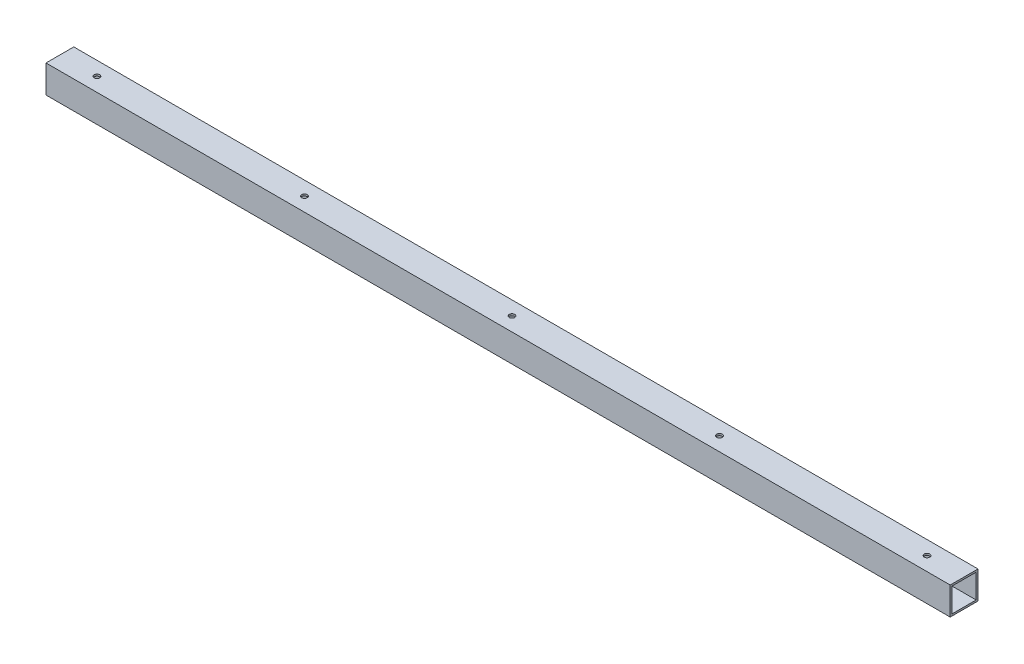
ISO-10303-21;
HEADER;
FILE_DESCRIPTION(('STEP AP214'),'2;1');
FILE_NAME('part.step','',(''),(''),'','','');
FILE_SCHEMA(('AUTOMOTIVE_DESIGN { 1 0 10303 214 1 1 1 1 }'));
ENDSEC;
DATA;
#1=APPLICATION_CONTEXT('core data for automotive mechanical design processes');
#2=APPLICATION_PROTOCOL_DEFINITION('international standard','automotive_design',2000,#1);
#3=PRODUCT_CONTEXT('',#1,'mechanical');
#4=PRODUCT('Part','Part','',(#3));
#5=PRODUCT_RELATED_PRODUCT_CATEGORY('part','',(#4));
#6=PRODUCT_DEFINITION_FORMATION('','',#4);
#7=PRODUCT_DEFINITION_CONTEXT('part definition',#1,'design');
#8=PRODUCT_DEFINITION('design','',#6,#7);
#9=PRODUCT_DEFINITION_SHAPE('','',#8);
#10=(LENGTH_UNIT() NAMED_UNIT(*) SI_UNIT(.MILLI.,.METRE.));
#11=(NAMED_UNIT(*) PLANE_ANGLE_UNIT() SI_UNIT($,.RADIAN.));
#12=(NAMED_UNIT(*) SI_UNIT($,.STERADIAN.) SOLID_ANGLE_UNIT());
#13=UNCERTAINTY_MEASURE_WITH_UNIT(LENGTH_MEASURE(1.E-05),#10,'distance_accuracy_value','');
#14=(GEOMETRIC_REPRESENTATION_CONTEXT(3) GLOBAL_UNCERTAINTY_ASSIGNED_CONTEXT((#13)) GLOBAL_UNIT_ASSIGNED_CONTEXT((#10,
#11,#12)) REPRESENTATION_CONTEXT('',''));
#15=CARTESIAN_POINT('',(0.,0.,0.));
#16=DIRECTION('',(0.,0.,1.));
#17=DIRECTION('',(1.,0.,0.));
#18=AXIS2_PLACEMENT_3D('',#15,#16,#17);
#19=CARTESIAN_POINT('',(244.,7.5,-7.5));
#20=DIRECTION('',(0.,0.,1.));
#21=DIRECTION('',(0.,-1.,0.));
#22=AXIS2_PLACEMENT_3D('',#19,#20,#21);
#23=PLANE('',#22);
#24=DIRECTION('',(0.,1.,0.));
#25=VECTOR('',#24,1.);
#26=CARTESIAN_POINT('',(-244.,7.5,-7.5));
#27=LINE('',#26,#25);
#28=CARTESIAN_POINT('',(-244.,-7.5,-7.5));
#29=VERTEX_POINT('',#28);
#30=CARTESIAN_POINT('',(-244.,7.5,-7.5));
#31=VERTEX_POINT('',#30);
#32=EDGE_CURVE('E160',#29,#31,#27,.T.);
#33=ORIENTED_EDGE('',*,*,#32,.T.);
#34=DIRECTION('',(-1.,0.,0.));
#35=VECTOR('',#34,1.);
#36=CARTESIAN_POINT('',(244.,7.5,-7.5));
#37=LINE('',#36,#35);
#38=CARTESIAN_POINT('',(244.,7.5,-7.5));
#39=VERTEX_POINT('',#38);
#40=EDGE_CURVE('E12',#39,#31,#37,.T.);
#41=ORIENTED_EDGE('',*,*,#40,.F.);
#42=DIRECTION('',(0.,1.,0.));
#43=VECTOR('',#42,1.);
#44=CARTESIAN_POINT('',(244.,7.5,-7.5));
#45=LINE('',#44,#43);
#46=CARTESIAN_POINT('',(244.,-7.5,-7.5));
#47=VERTEX_POINT('',#46);
#48=EDGE_CURVE('E133',#47,#39,#45,.T.);
#49=ORIENTED_EDGE('',*,*,#48,.F.);
#50=DIRECTION('',(-1.,0.,0.));
#51=VECTOR('',#50,1.);
#52=CARTESIAN_POINT('',(244.,-7.5,-7.5));
#53=LINE('',#52,#51);
#54=EDGE_CURVE('E167',#47,#29,#53,.T.);
#55=ORIENTED_EDGE('',*,*,#54,.T.);
#56=EDGE_LOOP('',(#33,#41,#49,#55));
#57=FACE_BOUND('',#56,.T.);
#58=ADVANCED_FACE('F52',(#57),#23,.F.);
#59=CARTESIAN_POINT('',(244.,7.5,7.5));
#60=DIRECTION('',(0.,-1.,0.));
#61=DIRECTION('',(0.,0.,-1.));
#62=AXIS2_PLACEMENT_3D('',#59,#60,#61);
#63=PLANE('',#62);
#64=CARTESIAN_POINT('',(-112.,7.5,0.));
#65=DIRECTION('',(0.,1.,0.));
#66=DIRECTION('',(0.,0.,1.));
#67=AXIS2_PLACEMENT_3D('',#64,#65,#66);
#68=CIRCLE('',#67,1.49999999999997);
#69=CARTESIAN_POINT('',(-112.,7.5,1.49999999999997));
#70=VERTEX_POINT('',#69);
#71=EDGE_CURVE('E235',#70,#70,#68,.T.);
#72=ORIENTED_EDGE('',*,*,#71,.F.);
#73=EDGE_LOOP('',(#72));
#74=FACE_BOUND('',#73,.T.);
#75=CARTESIAN_POINT('',(0.,7.5,0.));
#76=DIRECTION('',(0.,1.,0.));
#77=DIRECTION('',(0.,0.,1.));
#78=AXIS2_PLACEMENT_3D('',#75,#76,#77);
#79=CIRCLE('',#78,1.49999999999997);
#80=CARTESIAN_POINT('',(0.,7.5,1.49999999999997));
#81=VERTEX_POINT('',#80);
#82=EDGE_CURVE('E251',#81,#81,#79,.T.);
#83=ORIENTED_EDGE('',*,*,#82,.F.);
#84=EDGE_LOOP('',(#83));
#85=FACE_BOUND('',#84,.T.);
#86=CARTESIAN_POINT('',(112.,7.5,0.));
#87=DIRECTION('',(0.,1.,0.));
#88=DIRECTION('',(0.,0.,1.));
#89=AXIS2_PLACEMENT_3D('',#86,#87,#88);
#90=CIRCLE('',#89,1.49999999999997);
#91=CARTESIAN_POINT('',(112.,7.5,1.49999999999997));
#92=VERTEX_POINT('',#91);
#93=EDGE_CURVE('E245',#92,#92,#90,.T.);
#94=ORIENTED_EDGE('',*,*,#93,.F.);
#95=EDGE_LOOP('',(#94));
#96=FACE_BOUND('',#95,.T.);
#97=CARTESIAN_POINT('',(224.,7.5,0.));
#98=DIRECTION('',(0.,1.,0.));
#99=DIRECTION('',(0.,0.,1.));
#100=AXIS2_PLACEMENT_3D('',#97,#98,#99);
#101=CIRCLE('',#100,1.50000000000003);
#102=CARTESIAN_POINT('',(224.,7.5,1.50000000000002));
#103=VERTEX_POINT('',#102);
#104=EDGE_CURVE('E239',#103,#103,#101,.T.);
#105=ORIENTED_EDGE('',*,*,#104,.F.);
#106=EDGE_LOOP('',(#105));
#107=FACE_BOUND('',#106,.T.);
#108=CARTESIAN_POINT('',(-224.,7.5,0.));
#109=DIRECTION('',(0.,1.,0.));
#110=DIRECTION('',(0.,0.,1.));
#111=AXIS2_PLACEMENT_3D('',#108,#109,#110);
#112=CIRCLE('',#111,1.5);
#113=CARTESIAN_POINT('',(-224.,7.5,1.5));
#114=VERTEX_POINT('',#113);
#115=EDGE_CURVE('E205',#114,#114,#112,.T.);
#116=ORIENTED_EDGE('',*,*,#115,.F.);
#117=EDGE_LOOP('',(#116));
#118=FACE_BOUND('',#117,.T.);
#119=DIRECTION('',(0.,0.,1.));
#120=VECTOR('',#119,1.);
#121=CARTESIAN_POINT('',(-244.,7.5,7.5));
#122=LINE('',#121,#120);
#123=CARTESIAN_POINT('',(-244.,7.5,7.5));
#124=VERTEX_POINT('',#123);
#125=EDGE_CURVE('E138',#31,#124,#122,.T.);
#126=ORIENTED_EDGE('',*,*,#125,.T.);
#127=DIRECTION('',(-1.,0.,0.));
#128=VECTOR('',#127,1.);
#129=CARTESIAN_POINT('',(244.,7.5,7.5));
#130=LINE('',#129,#128);
#131=CARTESIAN_POINT('',(244.,7.5,7.5));
#132=VERTEX_POINT('',#131);
#133=EDGE_CURVE('E62',#132,#124,#130,.T.);
#134=ORIENTED_EDGE('',*,*,#133,.F.);
#135=DIRECTION('',(0.,0.,1.));
#136=VECTOR('',#135,1.);
#137=CARTESIAN_POINT('',(244.,7.5,7.5));
#138=LINE('',#137,#136);
#139=EDGE_CURVE('E127',#39,#132,#138,.T.);
#140=ORIENTED_EDGE('',*,*,#139,.F.);
#141=ORIENTED_EDGE('',*,*,#40,.T.);
#142=EDGE_LOOP('',(#126,#134,#140,#141));
#143=FACE_BOUND('',#142,.T.);
#144=ADVANCED_FACE('F137',(#74,#85,#96,#107,#118,#143),#63,.F.);
#145=CARTESIAN_POINT('',(244.,7.5,7.5));
#146=DIRECTION('',(0.,0.,-1.));
#147=DIRECTION('',(0.,1.,0.));
#148=AXIS2_PLACEMENT_3D('',#145,#146,#147);
#149=PLANE('',#148);
#150=DIRECTION('',(0.,-1.,0.));
#151=VECTOR('',#150,1.);
#152=CARTESIAN_POINT('',(-244.,7.5,7.5));
#153=LINE('',#152,#151);
#154=CARTESIAN_POINT('',(-244.,-7.5,7.5));
#155=VERTEX_POINT('',#154);
#156=EDGE_CURVE('E100',#124,#155,#153,.T.);
#157=ORIENTED_EDGE('',*,*,#156,.T.);
#158=DIRECTION('',(-1.,0.,0.));
#159=VECTOR('',#158,1.);
#160=CARTESIAN_POINT('',(244.,-7.5,7.5));
#161=LINE('',#160,#159);
#162=CARTESIAN_POINT('',(244.,-7.5,7.5));
#163=VERTEX_POINT('',#162);
#164=EDGE_CURVE('E139',#163,#155,#161,.T.);
#165=ORIENTED_EDGE('',*,*,#164,.F.);
#166=DIRECTION('',(0.,-1.,0.));
#167=VECTOR('',#166,1.);
#168=CARTESIAN_POINT('',(244.,7.5,7.5));
#169=LINE('',#168,#167);
#170=EDGE_CURVE('E131',#132,#163,#169,.T.);
#171=ORIENTED_EDGE('',*,*,#170,.F.);
#172=ORIENTED_EDGE('',*,*,#133,.T.);
#173=EDGE_LOOP('',(#157,#165,#171,#172));
#174=FACE_BOUND('',#173,.T.);
#175=ADVANCED_FACE('F141',(#174),#149,.F.);
#176=CARTESIAN_POINT('',(244.,6.5,6.5));
#177=DIRECTION('',(0.,0.,-1.));
#178=DIRECTION('',(-1.,0.,0.));
#179=AXIS2_PLACEMENT_3D('',#176,#177,#178);
#180=PLANE('',#179);
#181=DIRECTION('',(0.,-1.,0.));
#182=VECTOR('',#181,1.);
#183=CARTESIAN_POINT('',(-244.,6.5,6.5));
#184=LINE('',#183,#182);
#185=CARTESIAN_POINT('',(-244.,6.5,6.5));
#186=VERTEX_POINT('',#185);
#187=CARTESIAN_POINT('',(-244.,-6.5,6.5));
#188=VERTEX_POINT('',#187);
#189=EDGE_CURVE('E147',#186,#188,#184,.T.);
#190=ORIENTED_EDGE('',*,*,#189,.F.);
#191=DIRECTION('',(-1.,0.,0.));
#192=VECTOR('',#191,1.);
#193=CARTESIAN_POINT('',(244.,6.5,6.5));
#194=LINE('',#193,#192);
#195=CARTESIAN_POINT('',(244.,6.5,6.5));
#196=VERTEX_POINT('',#195);
#197=EDGE_CURVE('E56',#196,#186,#194,.T.);
#198=ORIENTED_EDGE('',*,*,#197,.F.);
#199=DIRECTION('',(0.,-1.,0.));
#200=VECTOR('',#199,1.);
#201=CARTESIAN_POINT('',(244.,6.5,6.5));
#202=LINE('',#201,#200);
#203=CARTESIAN_POINT('',(244.,-6.5,6.5));
#204=VERTEX_POINT('',#203);
#205=EDGE_CURVE('E166',#196,#204,#202,.T.);
#206=ORIENTED_EDGE('',*,*,#205,.T.);
#207=DIRECTION('',(-1.,0.,0.));
#208=VECTOR('',#207,1.);
#209=CARTESIAN_POINT('',(244.,-6.5,6.5));
#210=LINE('',#209,#208);
#211=EDGE_CURVE('E143',#204,#188,#210,.T.);
#212=ORIENTED_EDGE('',*,*,#211,.T.);
#213=EDGE_LOOP('',(#190,#198,#206,#212));
#214=FACE_BOUND('',#213,.T.);
#215=ADVANCED_FACE('F54',(#214),#180,.T.);
#216=CARTESIAN_POINT('',(244.,6.5,6.5));
#217=DIRECTION('',(0.,-1.,0.));
#218=DIRECTION('',(0.,0.,-1.));
#219=AXIS2_PLACEMENT_3D('',#216,#217,#218);
#220=PLANE('',#219);
#221=CARTESIAN_POINT('',(-112.,6.5,0.));
#222=DIRECTION('',(0.,-1.,0.));
#223=DIRECTION('',(0.,0.,-1.));
#224=AXIS2_PLACEMENT_3D('',#221,#222,#223);
#225=CIRCLE('',#224,1.49999999999997);
#226=CARTESIAN_POINT('',(-112.,6.5,-1.49999999999997));
#227=VERTEX_POINT('',#226);
#228=EDGE_CURVE('E209',#227,#227,#225,.F.);
#229=ORIENTED_EDGE('',*,*,#228,.T.);
#230=EDGE_LOOP('',(#229));
#231=FACE_BOUND('',#230,.T.);
#232=CARTESIAN_POINT('',(0.,6.5,0.));
#233=DIRECTION('',(0.,-1.,0.));
#234=DIRECTION('',(0.,0.,-1.));
#235=AXIS2_PLACEMENT_3D('',#232,#233,#234);
#236=CIRCLE('',#235,1.49999999999997);
#237=CARTESIAN_POINT('',(0.,6.5,-1.49999999999997));
#238=VERTEX_POINT('',#237);
#239=EDGE_CURVE('E217',#238,#238,#236,.F.);
#240=ORIENTED_EDGE('',*,*,#239,.T.);
#241=EDGE_LOOP('',(#240));
#242=FACE_BOUND('',#241,.T.);
#243=CARTESIAN_POINT('',(112.,6.5,0.));
#244=DIRECTION('',(0.,-1.,0.));
#245=DIRECTION('',(0.,0.,-1.));
#246=AXIS2_PLACEMENT_3D('',#243,#244,#245);
#247=CIRCLE('',#246,1.49999999999997);
#248=CARTESIAN_POINT('',(112.,6.5,-1.49999999999997));
#249=VERTEX_POINT('',#248);
#250=EDGE_CURVE('E223',#249,#249,#247,.F.);
#251=ORIENTED_EDGE('',*,*,#250,.T.);
#252=EDGE_LOOP('',(#251));
#253=FACE_BOUND('',#252,.T.);
#254=CARTESIAN_POINT('',(224.,6.5,0.));
#255=DIRECTION('',(0.,-1.,0.));
#256=DIRECTION('',(0.,0.,-1.));
#257=AXIS2_PLACEMENT_3D('',#254,#255,#256);
#258=CIRCLE('',#257,1.50000000000003);
#259=CARTESIAN_POINT('',(224.,6.5,-1.50000000000003));
#260=VERTEX_POINT('',#259);
#261=EDGE_CURVE('E229',#260,#260,#258,.F.);
#262=ORIENTED_EDGE('',*,*,#261,.T.);
#263=EDGE_LOOP('',(#262));
#264=FACE_BOUND('',#263,.T.);
#265=CARTESIAN_POINT('',(-224.,6.5,0.));
#266=DIRECTION('',(0.,-1.,0.));
#267=DIRECTION('',(0.,0.,-1.));
#268=AXIS2_PLACEMENT_3D('',#265,#266,#267);
#269=CIRCLE('',#268,1.5);
#270=CARTESIAN_POINT('',(-224.,6.5,-1.5));
#271=VERTEX_POINT('',#270);
#272=EDGE_CURVE('E151',#271,#271,#269,.F.);
#273=ORIENTED_EDGE('',*,*,#272,.T.);
#274=EDGE_LOOP('',(#273));
#275=FACE_BOUND('',#274,.T.);
#276=DIRECTION('',(0.,0.,1.));
#277=VECTOR('',#276,1.);
#278=CARTESIAN_POINT('',(-244.,6.5,6.5));
#279=LINE('',#278,#277);
#280=CARTESIAN_POINT('',(-244.,6.5,-6.5));
#281=VERTEX_POINT('',#280);
#282=EDGE_CURVE('E150',#281,#186,#279,.T.);
#283=ORIENTED_EDGE('',*,*,#282,.F.);
#284=DIRECTION('',(-1.,0.,0.));
#285=VECTOR('',#284,1.);
#286=CARTESIAN_POINT('',(244.,6.5,-6.5));
#287=LINE('',#286,#285);
#288=CARTESIAN_POINT('',(244.,6.5,-6.5));
#289=VERTEX_POINT('',#288);
#290=EDGE_CURVE('E172',#289,#281,#287,.T.);
#291=ORIENTED_EDGE('',*,*,#290,.F.);
#292=DIRECTION('',(0.,0.,1.));
#293=VECTOR('',#292,1.);
#294=CARTESIAN_POINT('',(244.,6.5,6.5));
#295=LINE('',#294,#293);
#296=EDGE_CURVE('E181',#289,#196,#295,.T.);
#297=ORIENTED_EDGE('',*,*,#296,.T.);
#298=ORIENTED_EDGE('',*,*,#197,.T.);
#299=EDGE_LOOP('',(#283,#291,#297,#298));
#300=FACE_BOUND('',#299,.T.);
#301=ADVANCED_FACE('F179',(#231,#242,#253,#264,#275,#300),#220,.T.);
#302=CARTESIAN_POINT('',(244.,6.5,-6.5));
#303=DIRECTION('',(0.,0.,1.));
#304=DIRECTION('',(0.,-1.,0.));
#305=AXIS2_PLACEMENT_3D('',#302,#303,#304);
#306=PLANE('',#305);
#307=DIRECTION('',(0.,1.,0.));
#308=VECTOR('',#307,1.);
#309=CARTESIAN_POINT('',(-244.,6.5,-6.5));
#310=LINE('',#309,#308);
#311=CARTESIAN_POINT('',(-244.,-6.5,-6.5));
#312=VERTEX_POINT('',#311);
#313=EDGE_CURVE('E154',#312,#281,#310,.T.);
#314=ORIENTED_EDGE('',*,*,#313,.F.);
#315=DIRECTION('',(-1.,0.,0.));
#316=VECTOR('',#315,1.);
#317=CARTESIAN_POINT('',(244.,-6.5,-6.5));
#318=LINE('',#317,#316);
#319=CARTESIAN_POINT('',(244.,-6.5,-6.5));
#320=VERTEX_POINT('',#319);
#321=EDGE_CURVE('E171',#320,#312,#318,.T.);
#322=ORIENTED_EDGE('',*,*,#321,.F.);
#323=DIRECTION('',(0.,1.,0.));
#324=VECTOR('',#323,1.);
#325=CARTESIAN_POINT('',(244.,6.5,-6.5));
#326=LINE('',#325,#324);
#327=EDGE_CURVE('E188',#320,#289,#326,.T.);
#328=ORIENTED_EDGE('',*,*,#327,.T.);
#329=ORIENTED_EDGE('',*,*,#290,.T.);
#330=EDGE_LOOP('',(#314,#322,#328,#329));
#331=FACE_BOUND('',#330,.T.);
#332=ADVANCED_FACE('F186',(#331),#306,.T.);
#333=CARTESIAN_POINT('',(244.,-6.5,6.5));
#334=DIRECTION('',(0.,1.,0.));
#335=DIRECTION('',(0.,0.,1.));
#336=AXIS2_PLACEMENT_3D('',#333,#334,#335);
#337=PLANE('',#336);
#338=CARTESIAN_POINT('',(-112.,-6.5,0.));
#339=DIRECTION('',(0.,1.,0.));
#340=DIRECTION('',(0.,0.,1.));
#341=AXIS2_PLACEMENT_3D('',#338,#339,#340);
#342=CIRCLE('',#341,1.49999999999997);
#343=CARTESIAN_POINT('',(-112.,-6.5,1.49999999999997));
#344=VERTEX_POINT('',#343);
#345=EDGE_CURVE('E214',#344,#344,#342,.F.);
#346=ORIENTED_EDGE('',*,*,#345,.T.);
#347=EDGE_LOOP('',(#346));
#348=FACE_BOUND('',#347,.T.);
#349=CARTESIAN_POINT('',(0.,-6.5,0.));
#350=DIRECTION('',(0.,1.,0.));
#351=DIRECTION('',(0.,0.,1.));
#352=AXIS2_PLACEMENT_3D('',#349,#350,#351);
#353=CIRCLE('',#352,1.49999999999997);
#354=CARTESIAN_POINT('',(0.,-6.5,1.49999999999997));
#355=VERTEX_POINT('',#354);
#356=EDGE_CURVE('E220',#355,#355,#353,.F.);
#357=ORIENTED_EDGE('',*,*,#356,.T.);
#358=EDGE_LOOP('',(#357));
#359=FACE_BOUND('',#358,.T.);
#360=CARTESIAN_POINT('',(112.,-6.5,0.));
#361=DIRECTION('',(0.,1.,0.));
#362=DIRECTION('',(0.,0.,1.));
#363=AXIS2_PLACEMENT_3D('',#360,#361,#362);
#364=CIRCLE('',#363,1.49999999999997);
#365=CARTESIAN_POINT('',(112.,-6.5,1.49999999999997));
#366=VERTEX_POINT('',#365);
#367=EDGE_CURVE('E226',#366,#366,#364,.F.);
#368=ORIENTED_EDGE('',*,*,#367,.T.);
#369=EDGE_LOOP('',(#368));
#370=FACE_BOUND('',#369,.T.);
#371=CARTESIAN_POINT('',(224.,-6.5,0.));
#372=DIRECTION('',(0.,1.,0.));
#373=DIRECTION('',(0.,0.,1.));
#374=AXIS2_PLACEMENT_3D('',#371,#372,#373);
#375=CIRCLE('',#374,1.50000000000003);
#376=CARTESIAN_POINT('',(224.,-6.5,1.50000000000002));
#377=VERTEX_POINT('',#376);
#378=EDGE_CURVE('E232',#377,#377,#375,.F.);
#379=ORIENTED_EDGE('',*,*,#378,.T.);
#380=EDGE_LOOP('',(#379));
#381=FACE_BOUND('',#380,.T.);
#382=CARTESIAN_POINT('',(-224.,-6.5,0.));
#383=DIRECTION('',(0.,1.,0.));
#384=DIRECTION('',(0.,0.,1.));
#385=AXIS2_PLACEMENT_3D('',#382,#383,#384);
#386=CIRCLE('',#385,1.5);
#387=CARTESIAN_POINT('',(-224.,-6.5,1.5));
#388=VERTEX_POINT('',#387);
#389=EDGE_CURVE('E202',#388,#388,#386,.F.);
#390=ORIENTED_EDGE('',*,*,#389,.T.);
#391=EDGE_LOOP('',(#390));
#392=FACE_BOUND('',#391,.T.);
#393=DIRECTION('',(0.,0.,-1.));
#394=VECTOR('',#393,1.);
#395=CARTESIAN_POINT('',(-244.,-6.5,6.5));
#396=LINE('',#395,#394);
#397=EDGE_CURVE('E157',#188,#312,#396,.T.);
#398=ORIENTED_EDGE('',*,*,#397,.F.);
#399=ORIENTED_EDGE('',*,*,#211,.F.);
#400=DIRECTION('',(0.,0.,-1.));
#401=VECTOR('',#400,1.);
#402=CARTESIAN_POINT('',(244.,-6.5,6.5));
#403=LINE('',#402,#401);
#404=EDGE_CURVE('E193',#204,#320,#403,.T.);
#405=ORIENTED_EDGE('',*,*,#404,.T.);
#406=ORIENTED_EDGE('',*,*,#321,.T.);
#407=EDGE_LOOP('',(#398,#399,#405,#406));
#408=FACE_BOUND('',#407,.T.);
#409=ADVANCED_FACE('F195',(#348,#359,#370,#381,#392,#408),#337,.T.);
#410=CARTESIAN_POINT('',(244.,-7.5,7.5));
#411=DIRECTION('',(0.,1.,0.));
#412=DIRECTION('',(0.,0.,1.));
#413=AXIS2_PLACEMENT_3D('',#410,#411,#412);
#414=PLANE('',#413);
#415=CARTESIAN_POINT('',(-112.,-7.5,0.));
#416=DIRECTION('',(0.,1.,0.));
#417=DIRECTION('',(0.,0.,1.));
#418=AXIS2_PLACEMENT_3D('',#415,#416,#417);
#419=CIRCLE('',#418,1.49999999999997);
#420=CARTESIAN_POINT('',(-112.,-7.5,1.49999999999997));
#421=VERTEX_POINT('',#420);
#422=EDGE_CURVE('E254',#421,#421,#419,.T.);
#423=ORIENTED_EDGE('',*,*,#422,.T.);
#424=EDGE_LOOP('',(#423));
#425=FACE_BOUND('',#424,.T.);
#426=CARTESIAN_POINT('',(0.,-7.5,0.));
#427=DIRECTION('',(0.,1.,0.));
#428=DIRECTION('',(0.,0.,1.));
#429=AXIS2_PLACEMENT_3D('',#426,#427,#428);
#430=CIRCLE('',#429,1.49999999999997);
#431=CARTESIAN_POINT('',(0.,-7.5,1.49999999999997));
#432=VERTEX_POINT('',#431);
#433=EDGE_CURVE('E248',#432,#432,#430,.T.);
#434=ORIENTED_EDGE('',*,*,#433,.T.);
#435=EDGE_LOOP('',(#434));
#436=FACE_BOUND('',#435,.T.);
#437=CARTESIAN_POINT('',(112.,-7.5,0.));
#438=DIRECTION('',(0.,1.,0.));
#439=DIRECTION('',(0.,0.,1.));
#440=AXIS2_PLACEMENT_3D('',#437,#438,#439);
#441=CIRCLE('',#440,1.49999999999997);
#442=CARTESIAN_POINT('',(112.,-7.5,1.49999999999997));
#443=VERTEX_POINT('',#442);
#444=EDGE_CURVE('E242',#443,#443,#441,.T.);
#445=ORIENTED_EDGE('',*,*,#444,.T.);
#446=EDGE_LOOP('',(#445));
#447=FACE_BOUND('',#446,.T.);
#448=CARTESIAN_POINT('',(224.,-7.5,0.));
#449=DIRECTION('',(0.,1.,0.));
#450=DIRECTION('',(0.,0.,1.));
#451=AXIS2_PLACEMENT_3D('',#448,#449,#450);
#452=CIRCLE('',#451,1.50000000000003);
#453=CARTESIAN_POINT('',(224.,-7.5,1.50000000000002));
#454=VERTEX_POINT('',#453);
#455=EDGE_CURVE('E236',#454,#454,#452,.T.);
#456=ORIENTED_EDGE('',*,*,#455,.T.);
#457=EDGE_LOOP('',(#456));
#458=FACE_BOUND('',#457,.T.);
#459=CARTESIAN_POINT('',(-224.,-7.5,0.));
#460=DIRECTION('',(0.,1.,0.));
#461=DIRECTION('',(0.,0.,1.));
#462=AXIS2_PLACEMENT_3D('',#459,#460,#461);
#463=CIRCLE('',#462,1.5);
#464=CARTESIAN_POINT('',(-224.,-7.5,1.5));
#465=VERTEX_POINT('',#464);
#466=EDGE_CURVE('E206',#465,#465,#463,.T.);
#467=ORIENTED_EDGE('',*,*,#466,.T.);
#468=EDGE_LOOP('',(#467));
#469=FACE_BOUND('',#468,.T.);
#470=DIRECTION('',(0.,0.,-1.));
#471=VECTOR('',#470,1.);
#472=CARTESIAN_POINT('',(-244.,-7.5,7.5));
#473=LINE('',#472,#471);
#474=EDGE_CURVE('E106',#155,#29,#473,.T.);
#475=ORIENTED_EDGE('',*,*,#474,.T.);
#476=ORIENTED_EDGE('',*,*,#54,.F.);
#477=DIRECTION('',(0.,0.,-1.));
#478=VECTOR('',#477,1.);
#479=CARTESIAN_POINT('',(244.,-7.5,7.5));
#480=LINE('',#479,#478);
#481=EDGE_CURVE('E71',#163,#47,#480,.T.);
#482=ORIENTED_EDGE('',*,*,#481,.F.);
#483=ORIENTED_EDGE('',*,*,#164,.T.);
#484=EDGE_LOOP('',(#475,#476,#482,#483));
#485=FACE_BOUND('',#484,.T.);
#486=ADVANCED_FACE('F299',(#425,#436,#447,#458,#469,#485),#414,.F.);
#487=CARTESIAN_POINT('',(244.,0.,0.));
#488=DIRECTION('',(1.,0.,0.));
#489=DIRECTION('',(0.,0.,-1.));
#490=AXIS2_PLACEMENT_3D('',#487,#488,#489);
#491=PLANE('',#490);
#492=ORIENTED_EDGE('',*,*,#205,.F.);
#493=ORIENTED_EDGE('',*,*,#296,.F.);
#494=ORIENTED_EDGE('',*,*,#327,.F.);
#495=ORIENTED_EDGE('',*,*,#404,.F.);
#496=EDGE_LOOP('',(#492,#493,#494,#495));
#497=FACE_BOUND('',#496,.T.);
#498=ORIENTED_EDGE('',*,*,#48,.T.);
#499=ORIENTED_EDGE('',*,*,#139,.T.);
#500=ORIENTED_EDGE('',*,*,#170,.T.);
#501=ORIENTED_EDGE('',*,*,#481,.T.);
#502=EDGE_LOOP('',(#498,#499,#500,#501));
#503=FACE_BOUND('',#502,.T.);
#504=ADVANCED_FACE('F129',(#497,#503),#491,.T.);
#505=CARTESIAN_POINT('',(-244.,0.,0.));
#506=DIRECTION('',(1.,0.,0.));
#507=DIRECTION('',(0.,0.,-1.));
#508=AXIS2_PLACEMENT_3D('',#505,#506,#507);
#509=PLANE('',#508);
#510=ORIENTED_EDGE('',*,*,#189,.T.);
#511=ORIENTED_EDGE('',*,*,#397,.T.);
#512=ORIENTED_EDGE('',*,*,#313,.T.);
#513=ORIENTED_EDGE('',*,*,#282,.T.);
#514=EDGE_LOOP('',(#510,#511,#512,#513));
#515=FACE_BOUND('',#514,.T.);
#516=ORIENTED_EDGE('',*,*,#32,.F.);
#517=ORIENTED_EDGE('',*,*,#474,.F.);
#518=ORIENTED_EDGE('',*,*,#156,.F.);
#519=ORIENTED_EDGE('',*,*,#125,.F.);
#520=EDGE_LOOP('',(#516,#517,#518,#519));
#521=FACE_BOUND('',#520,.T.);
#522=ADVANCED_FACE('F184',(#515,#521),#509,.F.);
#523=CARTESIAN_POINT('',(-224.,7.5,0.));
#524=DIRECTION('',(0.,-1.,0.));
#525=DIRECTION('',(0.,0.,-1.));
#526=AXIS2_PLACEMENT_3D('',#523,#524,#525);
#527=CYLINDRICAL_SURFACE('',#526,1.5);
#528=ORIENTED_EDGE('',*,*,#389,.F.);
#529=EDGE_LOOP('',(#528));
#530=FACE_BOUND('',#529,.T.);
#531=ORIENTED_EDGE('',*,*,#466,.F.);
#532=EDGE_LOOP('',(#531));
#533=FACE_BOUND('',#532,.T.);
#534=ADVANCED_FACE('F276',(#530,#533),#527,.F.);
#535=ORIENTED_EDGE('',*,*,#272,.F.);
#536=EDGE_LOOP('',(#535));
#537=FACE_BOUND('',#536,.T.);
#538=ORIENTED_EDGE('',*,*,#115,.T.);
#539=EDGE_LOOP('',(#538));
#540=FACE_BOUND('',#539,.T.);
#541=ADVANCED_FACE('F273',(#537,#540),#527,.F.);
#542=CARTESIAN_POINT('',(224.,7.5,0.));
#543=DIRECTION('',(0.,-1.,0.));
#544=DIRECTION('',(0.,0.,-1.));
#545=AXIS2_PLACEMENT_3D('',#542,#543,#544);
#546=CYLINDRICAL_SURFACE('',#545,1.50000000000003);
#547=ORIENTED_EDGE('',*,*,#378,.F.);
#548=EDGE_LOOP('',(#547));
#549=FACE_BOUND('',#548,.T.);
#550=ORIENTED_EDGE('',*,*,#455,.F.);
#551=EDGE_LOOP('',(#550));
#552=FACE_BOUND('',#551,.T.);
#553=ADVANCED_FACE('F275',(#549,#552),#546,.F.);
#554=CARTESIAN_POINT('',(112.,7.5,0.));
#555=DIRECTION('',(0.,-1.,0.));
#556=DIRECTION('',(0.,0.,-1.));
#557=AXIS2_PLACEMENT_3D('',#554,#555,#556);
#558=CYLINDRICAL_SURFACE('',#557,1.49999999999997);
#559=ORIENTED_EDGE('',*,*,#367,.F.);
#560=EDGE_LOOP('',(#559));
#561=FACE_BOUND('',#560,.T.);
#562=ORIENTED_EDGE('',*,*,#444,.F.);
#563=EDGE_LOOP('',(#562));
#564=FACE_BOUND('',#563,.T.);
#565=ADVANCED_FACE('F283',(#561,#564),#558,.F.);
#566=CARTESIAN_POINT('',(0.,7.5,0.));
#567=DIRECTION('',(0.,-1.,0.));
#568=DIRECTION('',(0.,0.,-1.));
#569=AXIS2_PLACEMENT_3D('',#566,#567,#568);
#570=CYLINDRICAL_SURFACE('',#569,1.49999999999997);
#571=ORIENTED_EDGE('',*,*,#356,.F.);
#572=EDGE_LOOP('',(#571));
#573=FACE_BOUND('',#572,.T.);
#574=ORIENTED_EDGE('',*,*,#433,.F.);
#575=EDGE_LOOP('',(#574));
#576=FACE_BOUND('',#575,.T.);
#577=ADVANCED_FACE('F327',(#573,#576),#570,.F.);
#578=CARTESIAN_POINT('',(-112.,7.5,0.));
#579=DIRECTION('',(0.,-1.,0.));
#580=DIRECTION('',(0.,0.,-1.));
#581=AXIS2_PLACEMENT_3D('',#578,#579,#580);
#582=CYLINDRICAL_SURFACE('',#581,1.49999999999997);
#583=ORIENTED_EDGE('',*,*,#345,.F.);
#584=EDGE_LOOP('',(#583));
#585=FACE_BOUND('',#584,.T.);
#586=ORIENTED_EDGE('',*,*,#422,.F.);
#587=EDGE_LOOP('',(#586));
#588=FACE_BOUND('',#587,.T.);
#589=ADVANCED_FACE('F319',(#585,#588),#582,.F.);
#590=ORIENTED_EDGE('',*,*,#261,.F.);
#591=EDGE_LOOP('',(#590));
#592=FACE_BOUND('',#591,.T.);
#593=ORIENTED_EDGE('',*,*,#104,.T.);
#594=EDGE_LOOP('',(#593));
#595=FACE_BOUND('',#594,.T.);
#596=ADVANCED_FACE('F286',(#592,#595),#546,.F.);
#597=ORIENTED_EDGE('',*,*,#250,.F.);
#598=EDGE_LOOP('',(#597));
#599=FACE_BOUND('',#598,.T.);
#600=ORIENTED_EDGE('',*,*,#93,.T.);
#601=EDGE_LOOP('',(#600));
#602=FACE_BOUND('',#601,.T.);
#603=ADVANCED_FACE('F318',(#599,#602),#558,.F.);
#604=ORIENTED_EDGE('',*,*,#239,.F.);
#605=EDGE_LOOP('',(#604));
#606=FACE_BOUND('',#605,.T.);
#607=ORIENTED_EDGE('',*,*,#82,.T.);
#608=EDGE_LOOP('',(#607));
#609=FACE_BOUND('',#608,.T.);
#610=ADVANCED_FACE('F324',(#606,#609),#570,.F.);
#611=ORIENTED_EDGE('',*,*,#228,.F.);
#612=EDGE_LOOP('',(#611));
#613=FACE_BOUND('',#612,.T.);
#614=ORIENTED_EDGE('',*,*,#71,.T.);
#615=EDGE_LOOP('',(#614));
#616=FACE_BOUND('',#615,.T.);
#617=ADVANCED_FACE('F260',(#613,#616),#582,.F.);
#618=CLOSED_SHELL('',(#58,#144,#175,#215,#301,#332,#409,#486,#504,#522,#534,#541,#553,#565,#577,
#589,#596,#603,#610,#617));
#619=MANIFOLD_SOLID_BREP('B2',#618);
#620=ADVANCED_BREP_SHAPE_REPRESENTATION('',(#18,#619),#14);
#621=SHAPE_DEFINITION_REPRESENTATION(#9,#620);
ENDSEC;
END-ISO-10303-21;
